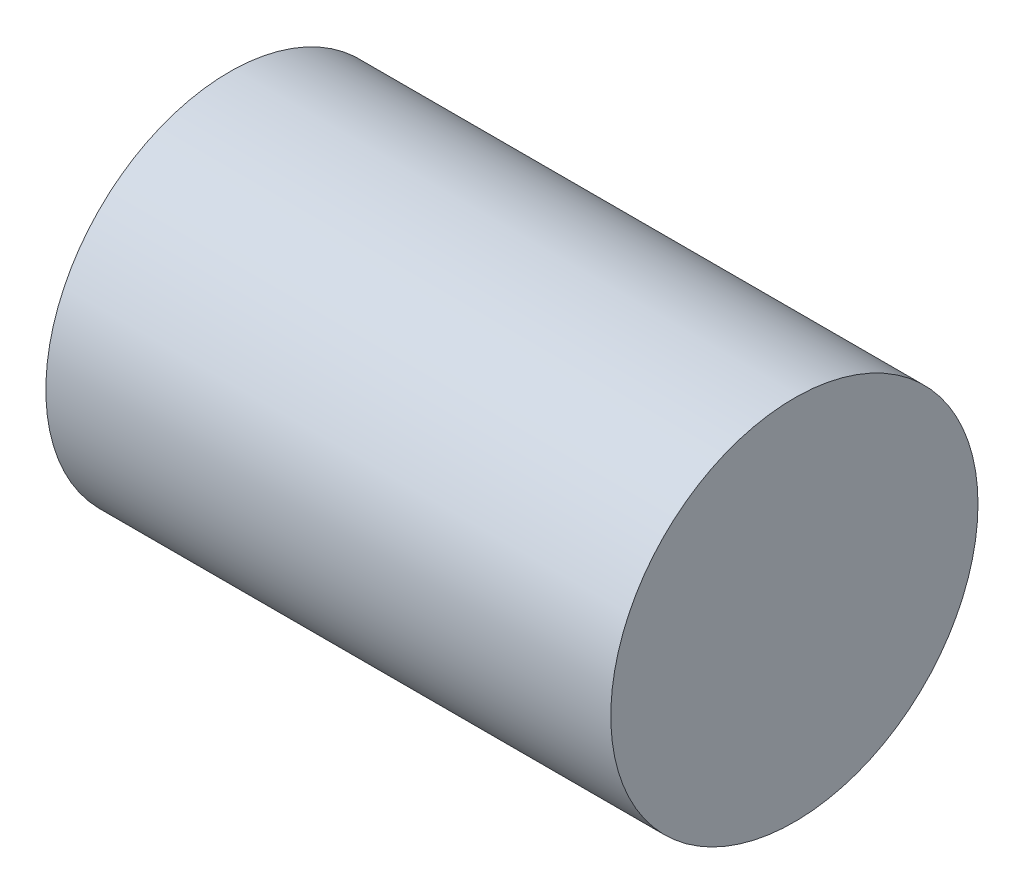
ISO-10303-21;
HEADER;
FILE_DESCRIPTION(('STEP AP214'),'2;1');
FILE_NAME('part.step','',(''),(''),'','','');
FILE_SCHEMA(('AUTOMOTIVE_DESIGN { 1 0 10303 214 1 1 1 1 }'));
ENDSEC;
DATA;
#1=APPLICATION_CONTEXT('core data for automotive mechanical design processes');
#2=APPLICATION_PROTOCOL_DEFINITION('international standard','automotive_design',2000,#1);
#3=PRODUCT_CONTEXT('',#1,'mechanical');
#4=PRODUCT('Part','Part','',(#3));
#5=PRODUCT_RELATED_PRODUCT_CATEGORY('part','',(#4));
#6=PRODUCT_DEFINITION_FORMATION('','',#4);
#7=PRODUCT_DEFINITION_CONTEXT('part definition',#1,'design');
#8=PRODUCT_DEFINITION('design','',#6,#7);
#9=PRODUCT_DEFINITION_SHAPE('','',#8);
#10=(LENGTH_UNIT() NAMED_UNIT(*) SI_UNIT(.MILLI.,.METRE.));
#11=(NAMED_UNIT(*) PLANE_ANGLE_UNIT() SI_UNIT($,.RADIAN.));
#12=(NAMED_UNIT(*) SI_UNIT($,.STERADIAN.) SOLID_ANGLE_UNIT());
#13=UNCERTAINTY_MEASURE_WITH_UNIT(LENGTH_MEASURE(1.E-05),#10,'distance_accuracy_value','');
#14=(GEOMETRIC_REPRESENTATION_CONTEXT(3) GLOBAL_UNCERTAINTY_ASSIGNED_CONTEXT((#13)) GLOBAL_UNIT_ASSIGNED_CONTEXT((#10,
#11,#12)) REPRESENTATION_CONTEXT('',''));
#15=CARTESIAN_POINT('',(0.,0.,0.));
#16=DIRECTION('',(0.,0.,1.));
#17=DIRECTION('',(1.,0.,0.));
#18=AXIS2_PLACEMENT_3D('',#15,#16,#17);
#19=CARTESIAN_POINT('',(80.,0.,0.));
#20=DIRECTION('',(-1.,0.,0.));
#21=DIRECTION('',(0.,0.,1.));
#22=AXIS2_PLACEMENT_3D('',#19,#20,#21);
#23=CYLINDRICAL_SURFACE('',#22,26.);
#24=CARTESIAN_POINT('',(80.,0.,0.));
#25=DIRECTION('',(1.,0.,0.));
#26=DIRECTION('',(0.,0.,-1.));
#27=AXIS2_PLACEMENT_3D('',#24,#25,#26);
#28=CIRCLE('',#27,26.);
#29=CARTESIAN_POINT('',(80.,0.,-26.));
#30=VERTEX_POINT('',#29);
#31=EDGE_CURVE('E10',#30,#30,#28,.T.);
#32=ORIENTED_EDGE('',*,*,#31,.F.);
#33=EDGE_LOOP('',(#32));
#34=FACE_BOUND('',#33,.T.);
#35=CARTESIAN_POINT('',(0.,0.,0.));
#36=DIRECTION('',(1.,0.,0.));
#37=DIRECTION('',(0.,0.,-1.));
#38=AXIS2_PLACEMENT_3D('',#35,#36,#37);
#39=CIRCLE('',#38,26.);
#40=CARTESIAN_POINT('',(0.,0.,-26.));
#41=VERTEX_POINT('',#40);
#42=EDGE_CURVE('E34',#41,#41,#39,.T.);
#43=ORIENTED_EDGE('',*,*,#42,.T.);
#44=EDGE_LOOP('',(#43));
#45=FACE_BOUND('',#44,.T.);
#46=ADVANCED_FACE('F31',(#34,#45),#23,.T.);
#47=CARTESIAN_POINT('',(80.,0.,0.));
#48=DIRECTION('',(1.,0.,0.));
#49=DIRECTION('',(0.,0.,-1.));
#50=AXIS2_PLACEMENT_3D('',#47,#48,#49);
#51=PLANE('',#50);
#52=ORIENTED_EDGE('',*,*,#31,.T.);
#53=EDGE_LOOP('',(#52));
#54=FACE_BOUND('',#53,.T.);
#55=ADVANCED_FACE('F46',(#54),#51,.T.);
#56=CARTESIAN_POINT('',(0.,0.,0.));
#57=DIRECTION('',(1.,0.,0.));
#58=DIRECTION('',(0.,0.,-1.));
#59=AXIS2_PLACEMENT_3D('',#56,#57,#58);
#60=PLANE('',#59);
#61=ORIENTED_EDGE('',*,*,#42,.F.);
#62=EDGE_LOOP('',(#61));
#63=FACE_BOUND('',#62,.T.);
#64=ADVANCED_FACE('F44',(#63),#60,.F.);
#65=CLOSED_SHELL('',(#46,#55,#64));
#66=MANIFOLD_SOLID_BREP('B2',#65);
#67=ADVANCED_BREP_SHAPE_REPRESENTATION('',(#18,#66),#14);
#68=SHAPE_DEFINITION_REPRESENTATION(#9,#67);
ENDSEC;
END-ISO-10303-21;
